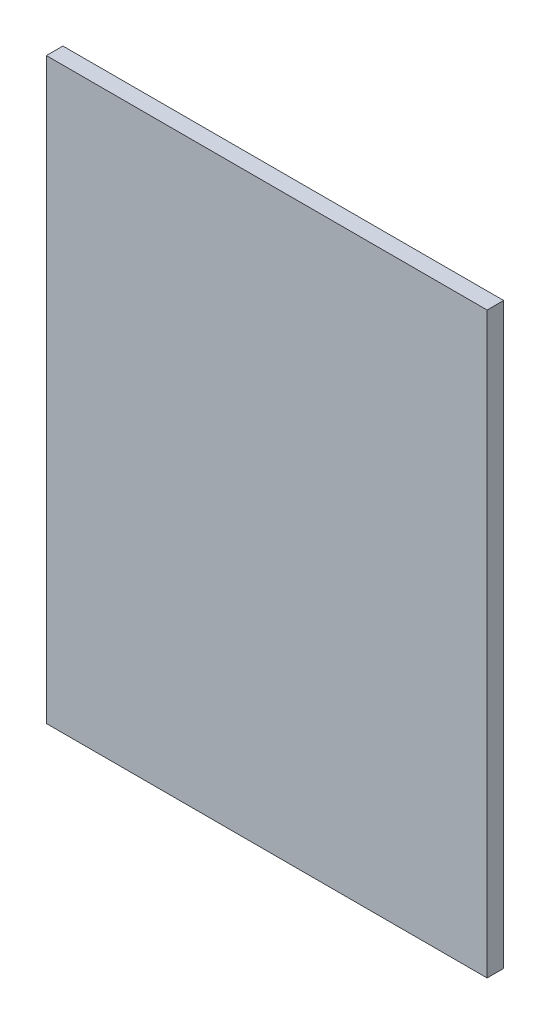
ISO-10303-21;
HEADER;
FILE_DESCRIPTION(('STEP AP214'),'2;1');
FILE_NAME('part.step','',(''),(''),'','','');
FILE_SCHEMA(('AUTOMOTIVE_DESIGN { 1 0 10303 214 1 1 1 1 }'));
ENDSEC;
DATA;
#1=APPLICATION_CONTEXT('core data for automotive mechanical design processes');
#2=APPLICATION_PROTOCOL_DEFINITION('international standard','automotive_design',2000,#1);
#3=PRODUCT_CONTEXT('',#1,'mechanical');
#4=PRODUCT('Part','Part','',(#3));
#5=PRODUCT_RELATED_PRODUCT_CATEGORY('part','',(#4));
#6=PRODUCT_DEFINITION_FORMATION('','',#4);
#7=PRODUCT_DEFINITION_CONTEXT('part definition',#1,'design');
#8=PRODUCT_DEFINITION('design','',#6,#7);
#9=PRODUCT_DEFINITION_SHAPE('','',#8);
#10=(LENGTH_UNIT() NAMED_UNIT(*) SI_UNIT(.MILLI.,.METRE.));
#11=(NAMED_UNIT(*) PLANE_ANGLE_UNIT() SI_UNIT($,.RADIAN.));
#12=(NAMED_UNIT(*) SI_UNIT($,.STERADIAN.) SOLID_ANGLE_UNIT());
#13=UNCERTAINTY_MEASURE_WITH_UNIT(LENGTH_MEASURE(1.E-05),#10,'distance_accuracy_value','');
#14=(GEOMETRIC_REPRESENTATION_CONTEXT(3) GLOBAL_UNCERTAINTY_ASSIGNED_CONTEXT((#13)) GLOBAL_UNIT_ASSIGNED_CONTEXT((#10,
#11,#12)) REPRESENTATION_CONTEXT('',''));
#15=CARTESIAN_POINT('',(0.,0.,0.));
#16=DIRECTION('',(0.,0.,1.));
#17=DIRECTION('',(1.,0.,0.));
#18=AXIS2_PLACEMENT_3D('',#15,#16,#17);
#19=CARTESIAN_POINT('',(40.,-52.5,3.));
#20=DIRECTION('',(-1.,0.,0.));
#21=DIRECTION('',(0.,0.,1.));
#22=AXIS2_PLACEMENT_3D('',#19,#20,#21);
#23=PLANE('',#22);
#24=DIRECTION('',(0.,1.,0.));
#25=VECTOR('',#24,1.);
#26=CARTESIAN_POINT('',(40.,-52.5,0.));
#27=LINE('',#26,#25);
#28=CARTESIAN_POINT('',(40.,-52.5,0.));
#29=VERTEX_POINT('',#28);
#30=CARTESIAN_POINT('',(40.,52.5,0.));
#31=VERTEX_POINT('',#30);
#32=EDGE_CURVE('E96',#29,#31,#27,.T.);
#33=ORIENTED_EDGE('',*,*,#32,.T.);
#34=DIRECTION('',(0.,0.,-1.));
#35=VECTOR('',#34,1.);
#36=CARTESIAN_POINT('',(40.,52.5,3.));
#37=LINE('',#36,#35);
#38=CARTESIAN_POINT('',(40.,52.5,3.));
#39=VERTEX_POINT('',#38);
#40=EDGE_CURVE('E11',#39,#31,#37,.T.);
#41=ORIENTED_EDGE('',*,*,#40,.F.);
#42=DIRECTION('',(0.,1.,0.));
#43=VECTOR('',#42,1.);
#44=CARTESIAN_POINT('',(40.,-52.5,3.));
#45=LINE('',#44,#43);
#46=CARTESIAN_POINT('',(40.,-52.5,3.));
#47=VERTEX_POINT('',#46);
#48=EDGE_CURVE('E84',#47,#39,#45,.T.);
#49=ORIENTED_EDGE('',*,*,#48,.F.);
#50=DIRECTION('',(0.,0.,-1.));
#51=VECTOR('',#50,1.);
#52=CARTESIAN_POINT('',(40.,-52.5,3.));
#53=LINE('',#52,#51);
#54=EDGE_CURVE('E92',#47,#29,#53,.T.);
#55=ORIENTED_EDGE('',*,*,#54,.T.);
#56=EDGE_LOOP('',(#33,#41,#49,#55));
#57=FACE_BOUND('',#56,.T.);
#58=ADVANCED_FACE('F33',(#57),#23,.F.);
#59=CARTESIAN_POINT('',(-40.,52.5,3.));
#60=DIRECTION('',(0.,-1.,0.));
#61=DIRECTION('',(0.,0.,-1.));
#62=AXIS2_PLACEMENT_3D('',#59,#60,#61);
#63=PLANE('',#62);
#64=DIRECTION('',(-1.,0.,0.));
#65=VECTOR('',#64,1.);
#66=CARTESIAN_POINT('',(-40.,52.5,0.));
#67=LINE('',#66,#65);
#68=CARTESIAN_POINT('',(-40.,52.5,0.));
#69=VERTEX_POINT('',#68);
#70=EDGE_CURVE('E88',#31,#69,#67,.T.);
#71=ORIENTED_EDGE('',*,*,#70,.T.);
#72=DIRECTION('',(0.,0.,-1.));
#73=VECTOR('',#72,1.);
#74=CARTESIAN_POINT('',(-40.,52.5,3.));
#75=LINE('',#74,#73);
#76=CARTESIAN_POINT('',(-40.,52.5,3.));
#77=VERTEX_POINT('',#76);
#78=EDGE_CURVE('E41',#77,#69,#75,.T.);
#79=ORIENTED_EDGE('',*,*,#78,.F.);
#80=DIRECTION('',(-1.,0.,0.));
#81=VECTOR('',#80,1.);
#82=CARTESIAN_POINT('',(-40.,52.5,3.));
#83=LINE('',#82,#81);
#84=EDGE_CURVE('E79',#39,#77,#83,.T.);
#85=ORIENTED_EDGE('',*,*,#84,.F.);
#86=ORIENTED_EDGE('',*,*,#40,.T.);
#87=EDGE_LOOP('',(#71,#79,#85,#86));
#88=FACE_BOUND('',#87,.T.);
#89=ADVANCED_FACE('F87',(#88),#63,.F.);
#90=CARTESIAN_POINT('',(-40.,-52.5,3.));
#91=DIRECTION('',(1.,0.,0.));
#92=DIRECTION('',(0.,0.,-1.));
#93=AXIS2_PLACEMENT_3D('',#90,#91,#92);
#94=PLANE('',#93);
#95=DIRECTION('',(0.,-1.,0.));
#96=VECTOR('',#95,1.);
#97=CARTESIAN_POINT('',(-40.,-52.5,0.));
#98=LINE('',#97,#96);
#99=CARTESIAN_POINT('',(-40.,-52.5,0.));
#100=VERTEX_POINT('',#99);
#101=EDGE_CURVE('E66',#69,#100,#98,.T.);
#102=ORIENTED_EDGE('',*,*,#101,.T.);
#103=DIRECTION('',(0.,0.,-1.));
#104=VECTOR('',#103,1.);
#105=CARTESIAN_POINT('',(-40.,-52.5,3.));
#106=LINE('',#105,#104);
#107=CARTESIAN_POINT('',(-40.,-52.5,3.));
#108=VERTEX_POINT('',#107);
#109=EDGE_CURVE('E89',#108,#100,#106,.T.);
#110=ORIENTED_EDGE('',*,*,#109,.F.);
#111=DIRECTION('',(0.,-1.,0.));
#112=VECTOR('',#111,1.);
#113=CARTESIAN_POINT('',(-40.,-52.5,3.));
#114=LINE('',#113,#112);
#115=EDGE_CURVE('E82',#77,#108,#114,.T.);
#116=ORIENTED_EDGE('',*,*,#115,.F.);
#117=ORIENTED_EDGE('',*,*,#78,.T.);
#118=EDGE_LOOP('',(#102,#110,#116,#117));
#119=FACE_BOUND('',#118,.T.);
#120=ADVANCED_FACE('F90',(#119),#94,.F.);
#121=CARTESIAN_POINT('',(-40.,-52.5,3.));
#122=DIRECTION('',(0.,1.,0.));
#123=DIRECTION('',(0.,0.,1.));
#124=AXIS2_PLACEMENT_3D('',#121,#122,#123);
#125=PLANE('',#124);
#126=DIRECTION('',(1.,0.,0.));
#127=VECTOR('',#126,1.);
#128=CARTESIAN_POINT('',(-40.,-52.5,0.));
#129=LINE('',#128,#127);
#130=EDGE_CURVE('E72',#100,#29,#129,.T.);
#131=ORIENTED_EDGE('',*,*,#130,.T.);
#132=ORIENTED_EDGE('',*,*,#54,.F.);
#133=DIRECTION('',(1.,0.,0.));
#134=VECTOR('',#133,1.);
#135=CARTESIAN_POINT('',(-40.,-52.5,3.));
#136=LINE('',#135,#134);
#137=EDGE_CURVE('E49',#108,#47,#136,.T.);
#138=ORIENTED_EDGE('',*,*,#137,.F.);
#139=ORIENTED_EDGE('',*,*,#109,.T.);
#140=EDGE_LOOP('',(#131,#132,#138,#139));
#141=FACE_BOUND('',#140,.T.);
#142=ADVANCED_FACE('F103',(#141),#125,.F.);
#143=CARTESIAN_POINT('',(0.,0.,3.));
#144=DIRECTION('',(0.,0.,-1.));
#145=DIRECTION('',(-1.,0.,0.));
#146=AXIS2_PLACEMENT_3D('',#143,#144,#145);
#147=PLANE('',#146);
#148=ORIENTED_EDGE('',*,*,#48,.T.);
#149=ORIENTED_EDGE('',*,*,#84,.T.);
#150=ORIENTED_EDGE('',*,*,#115,.T.);
#151=ORIENTED_EDGE('',*,*,#137,.T.);
#152=EDGE_LOOP('',(#148,#149,#150,#151));
#153=FACE_BOUND('',#152,.T.);
#154=ADVANCED_FACE('F80',(#153),#147,.F.);
#155=CARTESIAN_POINT('',(0.,0.,0.));
#156=DIRECTION('',(0.,0.,-1.));
#157=DIRECTION('',(-1.,0.,0.));
#158=AXIS2_PLACEMENT_3D('',#155,#156,#157);
#159=PLANE('',#158);
#160=ORIENTED_EDGE('',*,*,#32,.F.);
#161=ORIENTED_EDGE('',*,*,#130,.F.);
#162=ORIENTED_EDGE('',*,*,#101,.F.);
#163=ORIENTED_EDGE('',*,*,#70,.F.);
#164=EDGE_LOOP('',(#160,#161,#162,#163));
#165=FACE_BOUND('',#164,.T.);
#166=ADVANCED_FACE('F106',(#165),#159,.T.);
#167=CLOSED_SHELL('',(#58,#89,#120,#142,#154,#166));
#168=MANIFOLD_SOLID_BREP('B2',#167);
#169=ADVANCED_BREP_SHAPE_REPRESENTATION('',(#18,#168),#14);
#170=SHAPE_DEFINITION_REPRESENTATION(#9,#169);
ENDSEC;
END-ISO-10303-21;
